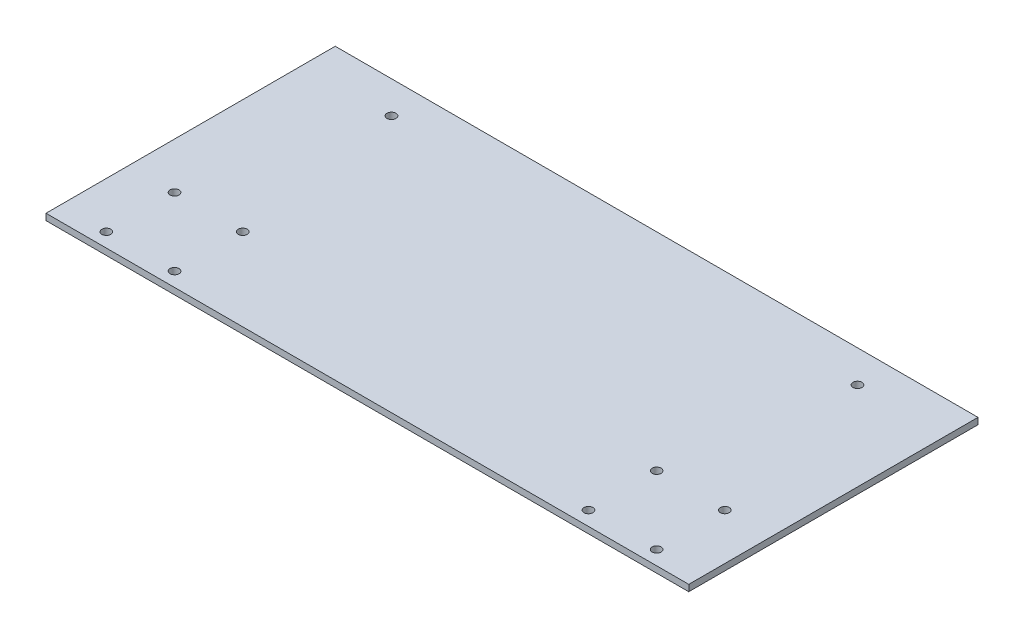
ISO-10303-21;
HEADER;
FILE_DESCRIPTION(('STEP AP214'),'2;1');
FILE_NAME('part.step','',(''),(''),'','','');
FILE_SCHEMA(('AUTOMOTIVE_DESIGN { 1 0 10303 214 1 1 1 1 }'));
ENDSEC;
DATA;
#1=APPLICATION_CONTEXT('core data for automotive mechanical design processes');
#2=APPLICATION_PROTOCOL_DEFINITION('international standard','automotive_design',2000,#1);
#3=PRODUCT_CONTEXT('',#1,'mechanical');
#4=PRODUCT('Part','Part','',(#3));
#5=PRODUCT_RELATED_PRODUCT_CATEGORY('part','',(#4));
#6=PRODUCT_DEFINITION_FORMATION('','',#4);
#7=PRODUCT_DEFINITION_CONTEXT('part definition',#1,'design');
#8=PRODUCT_DEFINITION('design','',#6,#7);
#9=PRODUCT_DEFINITION_SHAPE('','',#8);
#10=(LENGTH_UNIT() NAMED_UNIT(*) SI_UNIT(.MILLI.,.METRE.));
#11=(NAMED_UNIT(*) PLANE_ANGLE_UNIT() SI_UNIT($,.RADIAN.));
#12=(NAMED_UNIT(*) SI_UNIT($,.STERADIAN.) SOLID_ANGLE_UNIT());
#13=UNCERTAINTY_MEASURE_WITH_UNIT(LENGTH_MEASURE(1.E-05),#10,'distance_accuracy_value','');
#14=(GEOMETRIC_REPRESENTATION_CONTEXT(3) GLOBAL_UNCERTAINTY_ASSIGNED_CONTEXT((#13)) GLOBAL_UNIT_ASSIGNED_CONTEXT((#10,
#11,#12)) REPRESENTATION_CONTEXT('',''));
#15=CARTESIAN_POINT('',(0.,0.,0.));
#16=DIRECTION('',(0.,0.,1.));
#17=DIRECTION('',(1.,0.,0.));
#18=AXIS2_PLACEMENT_3D('',#15,#16,#17);
#19=CARTESIAN_POINT('',(0.,2.54,0.));
#20=DIRECTION('',(0.,-1.,0.));
#21=DIRECTION('',(0.,0.,-1.));
#22=AXIS2_PLACEMENT_3D('',#19,#20,#21);
#23=PLANE('',#22);
#24=DIRECTION('',(0.,0.,-1.));
#25=VECTOR('',#24,1.);
#26=CARTESIAN_POINT('',(127.,2.54,57.15));
#27=LINE('',#26,#25);
#28=CARTESIAN_POINT('',(127.,2.54,57.15));
#29=VERTEX_POINT('',#28);
#30=CARTESIAN_POINT('',(127.,2.54,-57.15));
#31=VERTEX_POINT('',#30);
#32=EDGE_CURVE('E85',#29,#31,#27,.T.);
#33=ORIENTED_EDGE('',*,*,#32,.T.);
#34=DIRECTION('',(-1.,0.,0.));
#35=VECTOR('',#34,1.);
#36=CARTESIAN_POINT('',(-127.,2.54,-57.15));
#37=LINE('',#36,#35);
#38=CARTESIAN_POINT('',(-127.,2.54,-57.15));
#39=VERTEX_POINT('',#38);
#40=EDGE_CURVE('E80',#31,#39,#37,.T.);
#41=ORIENTED_EDGE('',*,*,#40,.T.);
#42=DIRECTION('',(0.,0.,1.));
#43=VECTOR('',#42,1.);
#44=CARTESIAN_POINT('',(-127.,2.54,57.15));
#45=LINE('',#44,#43);
#46=CARTESIAN_POINT('',(-127.,2.54,57.15));
#47=VERTEX_POINT('',#46);
#48=EDGE_CURVE('E83',#39,#47,#45,.T.);
#49=ORIENTED_EDGE('',*,*,#48,.T.);
#50=DIRECTION('',(1.,0.,0.));
#51=VECTOR('',#50,1.);
#52=CARTESIAN_POINT('',(-127.,2.54,57.15));
#53=LINE('',#52,#51);
#54=EDGE_CURVE('E50',#47,#29,#53,.T.);
#55=ORIENTED_EDGE('',*,*,#54,.T.);
#56=EDGE_LOOP('',(#33,#41,#49,#55));
#57=FACE_BOUND('',#56,.T.);
#58=CARTESIAN_POINT('',(-108.720384181604,2.54,24.6296158183963));
#59=DIRECTION('',(0.,1.,0.));
#60=DIRECTION('',(0.,0.,1.));
#61=AXIS2_PLACEMENT_3D('',#58,#59,#60);
#62=CIRCLE('',#61,1.77799999999998);
#63=CARTESIAN_POINT('',(-108.720384181604,2.54,26.4076158183963));
#64=VERTEX_POINT('',#63);
#65=EDGE_CURVE('E100',#64,#64,#62,.T.);
#66=ORIENTED_EDGE('',*,*,#65,.F.);
#67=EDGE_LOOP('',(#66));
#68=FACE_BOUND('',#67,.T.);
#69=CARTESIAN_POINT('',(-81.7796158183963,2.54,24.6296158183963));
#70=DIRECTION('',(0.,1.,0.));
#71=DIRECTION('',(0.,0.,1.));
#72=AXIS2_PLACEMENT_3D('',#69,#70,#71);
#73=CIRCLE('',#72,1.77799999999999);
#74=CARTESIAN_POINT('',(-81.7796158183963,2.54,26.4076158183963));
#75=VERTEX_POINT('',#74);
#76=EDGE_CURVE('E115',#75,#75,#73,.T.);
#77=ORIENTED_EDGE('',*,*,#76,.F.);
#78=EDGE_LOOP('',(#77));
#79=FACE_BOUND('',#78,.T.);
#80=CARTESIAN_POINT('',(-108.720384181604,2.54,51.5703841816037));
#81=DIRECTION('',(0.,1.,0.));
#82=DIRECTION('',(0.,0.,1.));
#83=AXIS2_PLACEMENT_3D('',#80,#81,#82);
#84=CIRCLE('',#83,1.77799999999998);
#85=CARTESIAN_POINT('',(-108.720384181604,2.54,53.3483841816037));
#86=VERTEX_POINT('',#85);
#87=EDGE_CURVE('E121',#86,#86,#84,.T.);
#88=ORIENTED_EDGE('',*,*,#87,.F.);
#89=EDGE_LOOP('',(#88));
#90=FACE_BOUND('',#89,.T.);
#91=CARTESIAN_POINT('',(108.720384181604,2.54,24.6296158183963));
#92=DIRECTION('',(0.,1.,0.));
#93=DIRECTION('',(0.,0.,1.));
#94=AXIS2_PLACEMENT_3D('',#91,#92,#93);
#95=CIRCLE('',#94,1.77800000000001);
#96=CARTESIAN_POINT('',(108.720384181604,2.54,26.4076158183963));
#97=VERTEX_POINT('',#96);
#98=EDGE_CURVE('E127',#97,#97,#95,.T.);
#99=ORIENTED_EDGE('',*,*,#98,.F.);
#100=EDGE_LOOP('',(#99));
#101=FACE_BOUND('',#100,.T.);
#102=CARTESIAN_POINT('',(81.7796158183962,2.54,24.6296158183963));
#103=DIRECTION('',(0.,1.,0.));
#104=DIRECTION('',(0.,0.,1.));
#105=AXIS2_PLACEMENT_3D('',#102,#103,#104);
#106=CIRCLE('',#105,1.77799999999998);
#107=CARTESIAN_POINT('',(81.7796158183962,2.54,26.4076158183963));
#108=VERTEX_POINT('',#107);
#109=EDGE_CURVE('E133',#108,#108,#106,.T.);
#110=ORIENTED_EDGE('',*,*,#109,.F.);
#111=EDGE_LOOP('',(#110));
#112=FACE_BOUND('',#111,.T.);
#113=CARTESIAN_POINT('',(108.720384181604,2.54,51.5703841816037));
#114=DIRECTION('',(0.,1.,0.));
#115=DIRECTION('',(0.,0.,1.));
#116=AXIS2_PLACEMENT_3D('',#113,#114,#115);
#117=CIRCLE('',#116,1.77799999999999);
#118=CARTESIAN_POINT('',(108.720384181604,2.54,53.3483841816037));
#119=VERTEX_POINT('',#118);
#120=EDGE_CURVE('E139',#119,#119,#117,.T.);
#121=ORIENTED_EDGE('',*,*,#120,.F.);
#122=EDGE_LOOP('',(#121));
#123=FACE_BOUND('',#122,.T.);
#124=CARTESIAN_POINT('',(81.7796158183962,2.54,51.5703841816037));
#125=DIRECTION('',(0.,1.,0.));
#126=DIRECTION('',(0.,0.,1.));
#127=AXIS2_PLACEMENT_3D('',#124,#125,#126);
#128=CIRCLE('',#127,1.77799999999999);
#129=CARTESIAN_POINT('',(81.7796158183962,2.54,53.3483841816037));
#130=VERTEX_POINT('',#129);
#131=EDGE_CURVE('E145',#130,#130,#128,.T.);
#132=ORIENTED_EDGE('',*,*,#131,.F.);
#133=EDGE_LOOP('',(#132));
#134=FACE_BOUND('',#133,.T.);
#135=CARTESIAN_POINT('',(-81.7796158183963,2.54,51.5703841816037));
#136=DIRECTION('',(0.,1.,0.));
#137=DIRECTION('',(0.,0.,1.));
#138=AXIS2_PLACEMENT_3D('',#135,#136,#137);
#139=CIRCLE('',#138,1.77799999999999);
#140=CARTESIAN_POINT('',(-81.7796158183963,2.54,53.3483841816037));
#141=VERTEX_POINT('',#140);
#142=EDGE_CURVE('E151',#141,#141,#139,.T.);
#143=ORIENTED_EDGE('',*,*,#142,.F.);
#144=EDGE_LOOP('',(#143));
#145=FACE_BOUND('',#144,.T.);
#146=CARTESIAN_POINT('',(-92.075,2.54,-44.45));
#147=DIRECTION('',(0.,1.,0.));
#148=DIRECTION('',(0.,0.,1.));
#149=AXIS2_PLACEMENT_3D('',#146,#147,#148);
#150=CIRCLE('',#149,1.77800000000001);
#151=CARTESIAN_POINT('',(-92.075,2.54,-42.672));
#152=VERTEX_POINT('',#151);
#153=EDGE_CURVE('E157',#152,#152,#150,.T.);
#154=ORIENTED_EDGE('',*,*,#153,.F.);
#155=EDGE_LOOP('',(#154));
#156=FACE_BOUND('',#155,.T.);
#157=CARTESIAN_POINT('',(92.075,2.54,-44.45));
#158=DIRECTION('',(0.,1.,0.));
#159=DIRECTION('',(0.,0.,1.));
#160=AXIS2_PLACEMENT_3D('',#157,#158,#159);
#161=CIRCLE('',#160,1.77800000000001);
#162=CARTESIAN_POINT('',(92.075,2.54,-42.672));
#163=VERTEX_POINT('',#162);
#164=EDGE_CURVE('E163',#163,#163,#161,.T.);
#165=ORIENTED_EDGE('',*,*,#164,.F.);
#166=EDGE_LOOP('',(#165));
#167=FACE_BOUND('',#166,.T.);
#168=ADVANCED_FACE('F33',(#57,#68,#79,#90,#101,#112,#123,#134,#145,#156,#167),#23,.F.);
#169=CARTESIAN_POINT('',(0.,0.,0.));
#170=DIRECTION('',(0.,-1.,0.));
#171=DIRECTION('',(0.,0.,-1.));
#172=AXIS2_PLACEMENT_3D('',#169,#170,#171);
#173=PLANE('',#172);
#174=CARTESIAN_POINT('',(-92.075,0.,-44.45));
#175=DIRECTION('',(0.,1.,0.));
#176=DIRECTION('',(0.,0.,1.));
#177=AXIS2_PLACEMENT_3D('',#174,#175,#176);
#178=CIRCLE('',#177,1.77800000000001);
#179=CARTESIAN_POINT('',(-92.075,0.,-42.672));
#180=VERTEX_POINT('',#179);
#181=EDGE_CURVE('E160',#180,#180,#178,.T.);
#182=ORIENTED_EDGE('',*,*,#181,.T.);
#183=EDGE_LOOP('',(#182));
#184=FACE_BOUND('',#183,.T.);
#185=CARTESIAN_POINT('',(81.7796158183962,0.,51.5703841816037));
#186=DIRECTION('',(0.,1.,0.));
#187=DIRECTION('',(0.,0.,1.));
#188=AXIS2_PLACEMENT_3D('',#185,#186,#187);
#189=CIRCLE('',#188,1.77799999999999);
#190=CARTESIAN_POINT('',(81.7796158183962,0.,53.3483841816037));
#191=VERTEX_POINT('',#190);
#192=EDGE_CURVE('E148',#191,#191,#189,.T.);
#193=ORIENTED_EDGE('',*,*,#192,.T.);
#194=EDGE_LOOP('',(#193));
#195=FACE_BOUND('',#194,.T.);
#196=CARTESIAN_POINT('',(81.7796158183962,0.,24.6296158183963));
#197=DIRECTION('',(0.,1.,0.));
#198=DIRECTION('',(0.,0.,1.));
#199=AXIS2_PLACEMENT_3D('',#196,#197,#198);
#200=CIRCLE('',#199,1.77799999999998);
#201=CARTESIAN_POINT('',(81.7796158183962,0.,26.4076158183963));
#202=VERTEX_POINT('',#201);
#203=EDGE_CURVE('E136',#202,#202,#200,.T.);
#204=ORIENTED_EDGE('',*,*,#203,.T.);
#205=EDGE_LOOP('',(#204));
#206=FACE_BOUND('',#205,.T.);
#207=CARTESIAN_POINT('',(-108.720384181604,0.,51.5703841816037));
#208=DIRECTION('',(0.,1.,0.));
#209=DIRECTION('',(0.,0.,1.));
#210=AXIS2_PLACEMENT_3D('',#207,#208,#209);
#211=CIRCLE('',#210,1.77799999999998);
#212=CARTESIAN_POINT('',(-108.720384181604,0.,53.3483841816037));
#213=VERTEX_POINT('',#212);
#214=EDGE_CURVE('E124',#213,#213,#211,.T.);
#215=ORIENTED_EDGE('',*,*,#214,.T.);
#216=EDGE_LOOP('',(#215));
#217=FACE_BOUND('',#216,.T.);
#218=CARTESIAN_POINT('',(-108.720384181604,0.,24.6296158183963));
#219=DIRECTION('',(0.,1.,0.));
#220=DIRECTION('',(0.,0.,1.));
#221=AXIS2_PLACEMENT_3D('',#218,#219,#220);
#222=CIRCLE('',#221,1.77799999999998);
#223=CARTESIAN_POINT('',(-108.720384181604,0.,26.4076158183963));
#224=VERTEX_POINT('',#223);
#225=EDGE_CURVE('E112',#224,#224,#222,.T.);
#226=ORIENTED_EDGE('',*,*,#225,.T.);
#227=EDGE_LOOP('',(#226));
#228=FACE_BOUND('',#227,.T.);
#229=DIRECTION('',(0.,0.,-1.));
#230=VECTOR('',#229,1.);
#231=CARTESIAN_POINT('',(127.,0.,57.15));
#232=LINE('',#231,#230);
#233=CARTESIAN_POINT('',(127.,0.,57.15));
#234=VERTEX_POINT('',#233);
#235=CARTESIAN_POINT('',(127.,0.,-57.15));
#236=VERTEX_POINT('',#235);
#237=EDGE_CURVE('E97',#234,#236,#232,.T.);
#238=ORIENTED_EDGE('',*,*,#237,.F.);
#239=DIRECTION('',(1.,0.,0.));
#240=VECTOR('',#239,1.);
#241=CARTESIAN_POINT('',(-127.,0.,57.15));
#242=LINE('',#241,#240);
#243=CARTESIAN_POINT('',(-127.,0.,57.15));
#244=VERTEX_POINT('',#243);
#245=EDGE_CURVE('E73',#244,#234,#242,.T.);
#246=ORIENTED_EDGE('',*,*,#245,.F.);
#247=DIRECTION('',(0.,0.,1.));
#248=VECTOR('',#247,1.);
#249=CARTESIAN_POINT('',(-127.,0.,57.15));
#250=LINE('',#249,#248);
#251=CARTESIAN_POINT('',(-127.,0.,-57.15));
#252=VERTEX_POINT('',#251);
#253=EDGE_CURVE('E67',#252,#244,#250,.T.);
#254=ORIENTED_EDGE('',*,*,#253,.F.);
#255=DIRECTION('',(-1.,0.,0.));
#256=VECTOR('',#255,1.);
#257=CARTESIAN_POINT('',(-127.,0.,-57.15));
#258=LINE('',#257,#256);
#259=EDGE_CURVE('E89',#236,#252,#258,.T.);
#260=ORIENTED_EDGE('',*,*,#259,.F.);
#261=EDGE_LOOP('',(#238,#246,#254,#260));
#262=FACE_BOUND('',#261,.T.);
#263=CARTESIAN_POINT('',(-81.7796158183963,0.,24.6296158183963));
#264=DIRECTION('',(0.,1.,0.));
#265=DIRECTION('',(0.,0.,1.));
#266=AXIS2_PLACEMENT_3D('',#263,#264,#265);
#267=CIRCLE('',#266,1.77799999999999);
#268=CARTESIAN_POINT('',(-81.7796158183963,0.,26.4076158183963));
#269=VERTEX_POINT('',#268);
#270=EDGE_CURVE('E118',#269,#269,#267,.T.);
#271=ORIENTED_EDGE('',*,*,#270,.T.);
#272=EDGE_LOOP('',(#271));
#273=FACE_BOUND('',#272,.T.);
#274=CARTESIAN_POINT('',(108.720384181604,0.,24.6296158183963));
#275=DIRECTION('',(0.,1.,0.));
#276=DIRECTION('',(0.,0.,1.));
#277=AXIS2_PLACEMENT_3D('',#274,#275,#276);
#278=CIRCLE('',#277,1.77800000000001);
#279=CARTESIAN_POINT('',(108.720384181604,0.,26.4076158183963));
#280=VERTEX_POINT('',#279);
#281=EDGE_CURVE('E130',#280,#280,#278,.T.);
#282=ORIENTED_EDGE('',*,*,#281,.T.);
#283=EDGE_LOOP('',(#282));
#284=FACE_BOUND('',#283,.T.);
#285=CARTESIAN_POINT('',(108.720384181604,0.,51.5703841816037));
#286=DIRECTION('',(0.,1.,0.));
#287=DIRECTION('',(0.,0.,1.));
#288=AXIS2_PLACEMENT_3D('',#285,#286,#287);
#289=CIRCLE('',#288,1.77799999999999);
#290=CARTESIAN_POINT('',(108.720384181604,0.,53.3483841816037));
#291=VERTEX_POINT('',#290);
#292=EDGE_CURVE('E142',#291,#291,#289,.T.);
#293=ORIENTED_EDGE('',*,*,#292,.T.);
#294=EDGE_LOOP('',(#293));
#295=FACE_BOUND('',#294,.T.);
#296=CARTESIAN_POINT('',(-81.7796158183963,0.,51.5703841816037));
#297=DIRECTION('',(0.,1.,0.));
#298=DIRECTION('',(0.,0.,1.));
#299=AXIS2_PLACEMENT_3D('',#296,#297,#298);
#300=CIRCLE('',#299,1.77799999999999);
#301=CARTESIAN_POINT('',(-81.7796158183963,0.,53.3483841816037));
#302=VERTEX_POINT('',#301);
#303=EDGE_CURVE('E154',#302,#302,#300,.T.);
#304=ORIENTED_EDGE('',*,*,#303,.T.);
#305=EDGE_LOOP('',(#304));
#306=FACE_BOUND('',#305,.T.);
#307=CARTESIAN_POINT('',(92.075,0.,-44.45));
#308=DIRECTION('',(0.,1.,0.));
#309=DIRECTION('',(0.,0.,1.));
#310=AXIS2_PLACEMENT_3D('',#307,#308,#309);
#311=CIRCLE('',#310,1.77800000000001);
#312=CARTESIAN_POINT('',(92.075,0.,-42.672));
#313=VERTEX_POINT('',#312);
#314=EDGE_CURVE('E166',#313,#313,#311,.T.);
#315=ORIENTED_EDGE('',*,*,#314,.T.);
#316=EDGE_LOOP('',(#315));
#317=FACE_BOUND('',#316,.T.);
#318=ADVANCED_FACE('F108',(#184,#195,#206,#217,#228,#262,#273,#284,#295,#306,#317),#173,.T.);
#319=CARTESIAN_POINT('',(127.,2.54,57.15));
#320=DIRECTION('',(-1.,0.,0.));
#321=DIRECTION('',(0.,0.,1.));
#322=AXIS2_PLACEMENT_3D('',#319,#320,#321);
#323=PLANE('',#322);
#324=ORIENTED_EDGE('',*,*,#237,.T.);
#325=DIRECTION('',(0.,-1.,0.));
#326=VECTOR('',#325,1.);
#327=CARTESIAN_POINT('',(127.,2.54,-57.15));
#328=LINE('',#327,#326);
#329=EDGE_CURVE('E11',#31,#236,#328,.T.);
#330=ORIENTED_EDGE('',*,*,#329,.F.);
#331=ORIENTED_EDGE('',*,*,#32,.F.);
#332=DIRECTION('',(0.,-1.,0.));
#333=VECTOR('',#332,1.);
#334=CARTESIAN_POINT('',(127.,2.54,57.15));
#335=LINE('',#334,#333);
#336=EDGE_CURVE('E93',#29,#234,#335,.T.);
#337=ORIENTED_EDGE('',*,*,#336,.T.);
#338=EDGE_LOOP('',(#324,#330,#331,#337));
#339=FACE_BOUND('',#338,.T.);
#340=ADVANCED_FACE('F35',(#339),#323,.F.);
#341=CARTESIAN_POINT('',(-127.,2.54,-57.15));
#342=DIRECTION('',(0.,0.,1.));
#343=DIRECTION('',(1.,0.,0.));
#344=AXIS2_PLACEMENT_3D('',#341,#342,#343);
#345=PLANE('',#344);
#346=ORIENTED_EDGE('',*,*,#259,.T.);
#347=DIRECTION('',(0.,-1.,0.));
#348=VECTOR('',#347,1.);
#349=CARTESIAN_POINT('',(-127.,2.54,-57.15));
#350=LINE('',#349,#348);
#351=EDGE_CURVE('E42',#39,#252,#350,.T.);
#352=ORIENTED_EDGE('',*,*,#351,.F.);
#353=ORIENTED_EDGE('',*,*,#40,.F.);
#354=ORIENTED_EDGE('',*,*,#329,.T.);
#355=EDGE_LOOP('',(#346,#352,#353,#354));
#356=FACE_BOUND('',#355,.T.);
#357=ADVANCED_FACE('F88',(#356),#345,.F.);
#358=CARTESIAN_POINT('',(-127.,2.54,57.15));
#359=DIRECTION('',(1.,0.,0.));
#360=DIRECTION('',(0.,0.,-1.));
#361=AXIS2_PLACEMENT_3D('',#358,#359,#360);
#362=PLANE('',#361);
#363=ORIENTED_EDGE('',*,*,#253,.T.);
#364=DIRECTION('',(0.,-1.,0.));
#365=VECTOR('',#364,1.);
#366=CARTESIAN_POINT('',(-127.,2.54,57.15));
#367=LINE('',#366,#365);
#368=EDGE_CURVE('E90',#47,#244,#367,.T.);
#369=ORIENTED_EDGE('',*,*,#368,.F.);
#370=ORIENTED_EDGE('',*,*,#48,.F.);
#371=ORIENTED_EDGE('',*,*,#351,.T.);
#372=EDGE_LOOP('',(#363,#369,#370,#371));
#373=FACE_BOUND('',#372,.T.);
#374=ADVANCED_FACE('F91',(#373),#362,.F.);
#375=CARTESIAN_POINT('',(-127.,2.54,57.15));
#376=DIRECTION('',(0.,0.,-1.));
#377=DIRECTION('',(-1.,0.,0.));
#378=AXIS2_PLACEMENT_3D('',#375,#376,#377);
#379=PLANE('',#378);
#380=ORIENTED_EDGE('',*,*,#245,.T.);
#381=ORIENTED_EDGE('',*,*,#336,.F.);
#382=ORIENTED_EDGE('',*,*,#54,.F.);
#383=ORIENTED_EDGE('',*,*,#368,.T.);
#384=EDGE_LOOP('',(#380,#381,#382,#383));
#385=FACE_BOUND('',#384,.T.);
#386=ADVANCED_FACE('F105',(#385),#379,.F.);
#387=CARTESIAN_POINT('',(-108.720384181604,2.54,24.6296158183963));
#388=DIRECTION('',(0.,-1.,0.));
#389=DIRECTION('',(0.,0.,-1.));
#390=AXIS2_PLACEMENT_3D('',#387,#388,#389);
#391=CYLINDRICAL_SURFACE('',#390,1.77799999999998);
#392=ORIENTED_EDGE('',*,*,#65,.T.);
#393=EDGE_LOOP('',(#392));
#394=FACE_BOUND('',#393,.T.);
#395=ORIENTED_EDGE('',*,*,#225,.F.);
#396=EDGE_LOOP('',(#395));
#397=FACE_BOUND('',#396,.T.);
#398=ADVANCED_FACE('F183',(#394,#397),#391,.F.);
#399=CARTESIAN_POINT('',(-81.7796158183963,2.54,24.6296158183963));
#400=DIRECTION('',(0.,-1.,0.));
#401=DIRECTION('',(0.,0.,-1.));
#402=AXIS2_PLACEMENT_3D('',#399,#400,#401);
#403=CYLINDRICAL_SURFACE('',#402,1.77799999999999);
#404=ORIENTED_EDGE('',*,*,#76,.T.);
#405=EDGE_LOOP('',(#404));
#406=FACE_BOUND('',#405,.T.);
#407=ORIENTED_EDGE('',*,*,#270,.F.);
#408=EDGE_LOOP('',(#407));
#409=FACE_BOUND('',#408,.T.);
#410=ADVANCED_FACE('F229',(#406,#409),#403,.F.);
#411=CARTESIAN_POINT('',(-108.720384181604,2.54,51.5703841816037));
#412=DIRECTION('',(0.,-1.,0.));
#413=DIRECTION('',(0.,0.,-1.));
#414=AXIS2_PLACEMENT_3D('',#411,#412,#413);
#415=CYLINDRICAL_SURFACE('',#414,1.77799999999998);
#416=ORIENTED_EDGE('',*,*,#87,.T.);
#417=EDGE_LOOP('',(#416));
#418=FACE_BOUND('',#417,.T.);
#419=ORIENTED_EDGE('',*,*,#214,.F.);
#420=EDGE_LOOP('',(#419));
#421=FACE_BOUND('',#420,.T.);
#422=ADVANCED_FACE('F237',(#418,#421),#415,.F.);
#423=CARTESIAN_POINT('',(108.720384181604,2.54,24.6296158183963));
#424=DIRECTION('',(0.,-1.,0.));
#425=DIRECTION('',(0.,0.,-1.));
#426=AXIS2_PLACEMENT_3D('',#423,#424,#425);
#427=CYLINDRICAL_SURFACE('',#426,1.77800000000001);
#428=ORIENTED_EDGE('',*,*,#98,.T.);
#429=EDGE_LOOP('',(#428));
#430=FACE_BOUND('',#429,.T.);
#431=ORIENTED_EDGE('',*,*,#281,.F.);
#432=EDGE_LOOP('',(#431));
#433=FACE_BOUND('',#432,.T.);
#434=ADVANCED_FACE('F245',(#430,#433),#427,.F.);
#435=CARTESIAN_POINT('',(81.7796158183962,2.54,24.6296158183963));
#436=DIRECTION('',(0.,-1.,0.));
#437=DIRECTION('',(0.,0.,-1.));
#438=AXIS2_PLACEMENT_3D('',#435,#436,#437);
#439=CYLINDRICAL_SURFACE('',#438,1.77799999999998);
#440=ORIENTED_EDGE('',*,*,#109,.T.);
#441=EDGE_LOOP('',(#440));
#442=FACE_BOUND('',#441,.T.);
#443=ORIENTED_EDGE('',*,*,#203,.F.);
#444=EDGE_LOOP('',(#443));
#445=FACE_BOUND('',#444,.T.);
#446=ADVANCED_FACE('F254',(#442,#445),#439,.F.);
#447=CARTESIAN_POINT('',(108.720384181604,2.54,51.5703841816037));
#448=DIRECTION('',(0.,-1.,0.));
#449=DIRECTION('',(0.,0.,-1.));
#450=AXIS2_PLACEMENT_3D('',#447,#448,#449);
#451=CYLINDRICAL_SURFACE('',#450,1.77799999999999);
#452=ORIENTED_EDGE('',*,*,#120,.T.);
#453=EDGE_LOOP('',(#452));
#454=FACE_BOUND('',#453,.T.);
#455=ORIENTED_EDGE('',*,*,#292,.F.);
#456=EDGE_LOOP('',(#455));
#457=FACE_BOUND('',#456,.T.);
#458=ADVANCED_FACE('F263',(#454,#457),#451,.F.);
#459=CARTESIAN_POINT('',(81.7796158183962,2.54,51.5703841816037));
#460=DIRECTION('',(0.,-1.,0.));
#461=DIRECTION('',(0.,0.,-1.));
#462=AXIS2_PLACEMENT_3D('',#459,#460,#461);
#463=CYLINDRICAL_SURFACE('',#462,1.77799999999999);
#464=ORIENTED_EDGE('',*,*,#131,.T.);
#465=EDGE_LOOP('',(#464));
#466=FACE_BOUND('',#465,.T.);
#467=ORIENTED_EDGE('',*,*,#192,.F.);
#468=EDGE_LOOP('',(#467));
#469=FACE_BOUND('',#468,.T.);
#470=ADVANCED_FACE('F272',(#466,#469),#463,.F.);
#471=CARTESIAN_POINT('',(-81.7796158183963,2.54,51.5703841816037));
#472=DIRECTION('',(0.,-1.,0.));
#473=DIRECTION('',(0.,0.,-1.));
#474=AXIS2_PLACEMENT_3D('',#471,#472,#473);
#475=CYLINDRICAL_SURFACE('',#474,1.77799999999999);
#476=ORIENTED_EDGE('',*,*,#142,.T.);
#477=EDGE_LOOP('',(#476));
#478=FACE_BOUND('',#477,.T.);
#479=ORIENTED_EDGE('',*,*,#303,.F.);
#480=EDGE_LOOP('',(#479));
#481=FACE_BOUND('',#480,.T.);
#482=ADVANCED_FACE('F281',(#478,#481),#475,.F.);
#483=CARTESIAN_POINT('',(-92.075,2.54,-44.45));
#484=DIRECTION('',(0.,-1.,0.));
#485=DIRECTION('',(0.,0.,-1.));
#486=AXIS2_PLACEMENT_3D('',#483,#484,#485);
#487=CYLINDRICAL_SURFACE('',#486,1.77800000000001);
#488=ORIENTED_EDGE('',*,*,#153,.T.);
#489=EDGE_LOOP('',(#488));
#490=FACE_BOUND('',#489,.T.);
#491=ORIENTED_EDGE('',*,*,#181,.F.);
#492=EDGE_LOOP('',(#491));
#493=FACE_BOUND('',#492,.T.);
#494=ADVANCED_FACE('F290',(#490,#493),#487,.F.);
#495=CARTESIAN_POINT('',(92.075,2.54,-44.45));
#496=DIRECTION('',(0.,-1.,0.));
#497=DIRECTION('',(0.,0.,-1.));
#498=AXIS2_PLACEMENT_3D('',#495,#496,#497);
#499=CYLINDRICAL_SURFACE('',#498,1.77800000000001);
#500=ORIENTED_EDGE('',*,*,#164,.T.);
#501=EDGE_LOOP('',(#500));
#502=FACE_BOUND('',#501,.T.);
#503=ORIENTED_EDGE('',*,*,#314,.F.);
#504=EDGE_LOOP('',(#503));
#505=FACE_BOUND('',#504,.T.);
#506=ADVANCED_FACE('F172',(#502,#505),#499,.F.);
#507=CLOSED_SHELL('',(#168,#318,#340,#357,#374,#386,#398,#410,#422,#434,#446,#458,#470,#482,
#494,#506));
#508=MANIFOLD_SOLID_BREP('B2',#507);
#509=ADVANCED_BREP_SHAPE_REPRESENTATION('',(#18,#508),#14);
#510=SHAPE_DEFINITION_REPRESENTATION(#9,#509);
ENDSEC;
END-ISO-10303-21;
